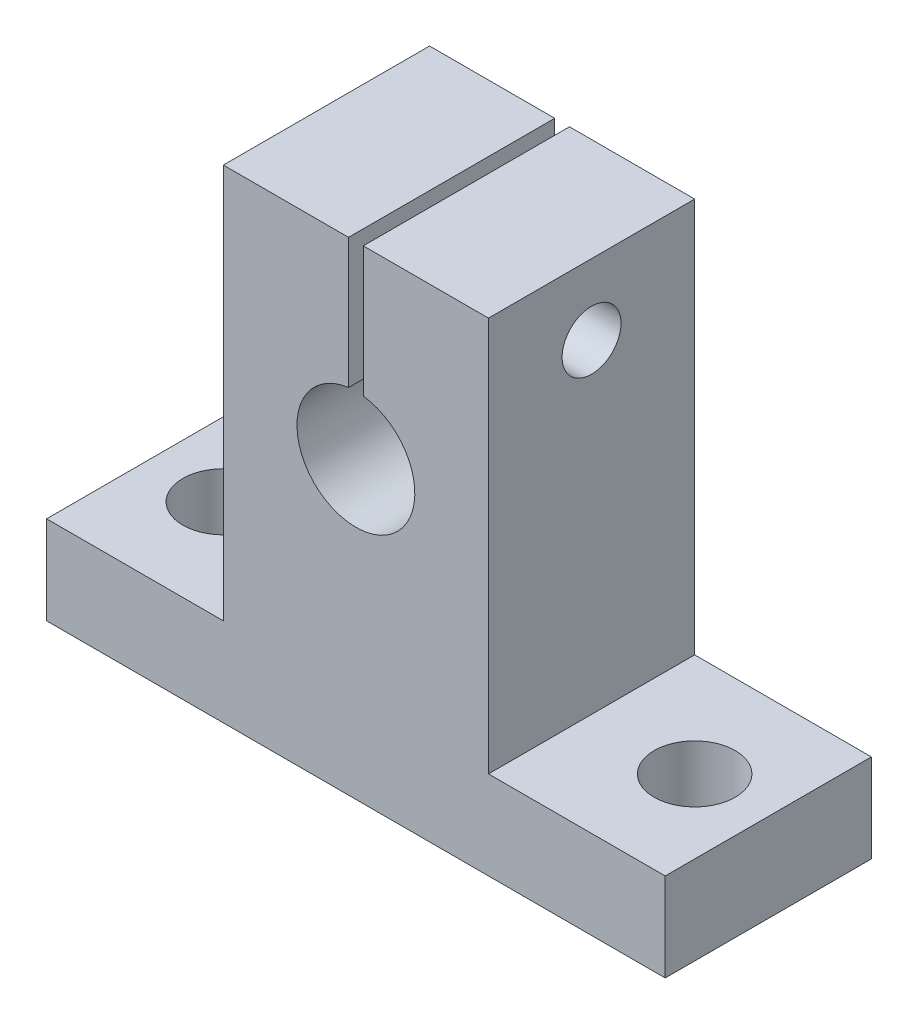
ISO-10303-21;
HEADER;
FILE_DESCRIPTION(('STEP AP214'),'2;1');
FILE_NAME('part.step','',(''),(''),'','','');
FILE_SCHEMA(('AUTOMOTIVE_DESIGN { 1 0 10303 214 1 1 1 1 }'));
ENDSEC;
DATA;
#1=APPLICATION_CONTEXT('core data for automotive mechanical design processes');
#2=APPLICATION_PROTOCOL_DEFINITION('international standard','automotive_design',2000,#1);
#3=PRODUCT_CONTEXT('',#1,'mechanical');
#4=PRODUCT('Part','Part','',(#3));
#5=PRODUCT_RELATED_PRODUCT_CATEGORY('part','',(#4));
#6=PRODUCT_DEFINITION_FORMATION('','',#4);
#7=PRODUCT_DEFINITION_CONTEXT('part definition',#1,'design');
#8=PRODUCT_DEFINITION('design','',#6,#7);
#9=PRODUCT_DEFINITION_SHAPE('','',#8);
#10=(LENGTH_UNIT() NAMED_UNIT(*) SI_UNIT(.MILLI.,.METRE.));
#11=(NAMED_UNIT(*) PLANE_ANGLE_UNIT() SI_UNIT($,.RADIAN.));
#12=(NAMED_UNIT(*) SI_UNIT($,.STERADIAN.) SOLID_ANGLE_UNIT());
#13=UNCERTAINTY_MEASURE_WITH_UNIT(LENGTH_MEASURE(1.E-05),#10,'distance_accuracy_value','');
#14=(GEOMETRIC_REPRESENTATION_CONTEXT(3) GLOBAL_UNCERTAINTY_ASSIGNED_CONTEXT((#13)) GLOBAL_UNIT_ASSIGNED_CONTEXT((#10,
#11,#12)) REPRESENTATION_CONTEXT('',''));
#15=CARTESIAN_POINT('',(0.,0.,0.));
#16=DIRECTION('',(0.,0.,1.));
#17=DIRECTION('',(1.,0.,0.));
#18=AXIS2_PLACEMENT_3D('',#15,#16,#17);
#19=CARTESIAN_POINT('',(9.,6.,7.));
#20=DIRECTION('',(-1.,0.,0.));
#21=DIRECTION('',(0.,0.,1.));
#22=AXIS2_PLACEMENT_3D('',#19,#20,#21);
#23=PLANE('',#22);
#24=CARTESIAN_POINT('',(9.,28.,0.));
#25=DIRECTION('',(1.,0.,0.));
#26=DIRECTION('',(0.,0.,-1.));
#27=AXIS2_PLACEMENT_3D('',#24,#25,#26);
#28=CIRCLE('',#27,2.);
#29=CARTESIAN_POINT('',(9.,28.,-2.));
#30=VERTEX_POINT('',#29);
#31=EDGE_CURVE('E268',#30,#30,#28,.T.);
#32=ORIENTED_EDGE('',*,*,#31,.F.);
#33=EDGE_LOOP('',(#32));
#34=FACE_BOUND('',#33,.T.);
#35=DIRECTION('',(0.,1.,0.));
#36=VECTOR('',#35,1.);
#37=CARTESIAN_POINT('',(9.,6.,-7.));
#38=LINE('',#37,#36);
#39=CARTESIAN_POINT('',(9.,6.,-7.));
#40=VERTEX_POINT('',#39);
#41=CARTESIAN_POINT('',(9.,32.8,-7.));
#42=VERTEX_POINT('',#41);
#43=EDGE_CURVE('E157',#40,#42,#38,.T.);
#44=ORIENTED_EDGE('',*,*,#43,.T.);
#45=DIRECTION('',(0.,0.,-1.));
#46=VECTOR('',#45,1.);
#47=CARTESIAN_POINT('',(9.,32.8,7.));
#48=LINE('',#47,#46);
#49=CARTESIAN_POINT('',(9.,32.8,7.));
#50=VERTEX_POINT('',#49);
#51=EDGE_CURVE('E11',#50,#42,#48,.T.);
#52=ORIENTED_EDGE('',*,*,#51,.F.);
#53=DIRECTION('',(0.,1.,0.));
#54=VECTOR('',#53,1.);
#55=CARTESIAN_POINT('',(9.,6.,7.));
#56=LINE('',#55,#54);
#57=CARTESIAN_POINT('',(9.,6.,7.));
#58=VERTEX_POINT('',#57);
#59=EDGE_CURVE('E180',#58,#50,#56,.T.);
#60=ORIENTED_EDGE('',*,*,#59,.F.);
#61=DIRECTION('',(0.,0.,-1.));
#62=VECTOR('',#61,1.);
#63=CARTESIAN_POINT('',(9.,6.,7.));
#64=LINE('',#63,#62);
#65=EDGE_CURVE('E153',#58,#40,#64,.T.);
#66=ORIENTED_EDGE('',*,*,#65,.T.);
#67=EDGE_LOOP('',(#44,#52,#60,#66));
#68=FACE_BOUND('',#67,.T.);
#69=ADVANCED_FACE('F35',(#34,#68),#23,.F.);
#70=CARTESIAN_POINT('',(0.499999999999996,32.8,7.));
#71=DIRECTION('',(0.,-1.,0.));
#72=DIRECTION('',(0.,0.,-1.));
#73=AXIS2_PLACEMENT_3D('',#70,#71,#72);
#74=PLANE('',#73);
#75=DIRECTION('',(-1.,0.,0.));
#76=VECTOR('',#75,1.);
#77=CARTESIAN_POINT('',(0.499999999999996,32.8,-7.));
#78=LINE('',#77,#76);
#79=CARTESIAN_POINT('',(0.499999999999996,32.8,-7.));
#80=VERTEX_POINT('',#79);
#81=EDGE_CURVE('E160',#42,#80,#78,.T.);
#82=ORIENTED_EDGE('',*,*,#81,.T.);
#83=DIRECTION('',(0.,0.,-1.));
#84=VECTOR('',#83,1.);
#85=CARTESIAN_POINT('',(0.499999999999996,32.8,7.));
#86=LINE('',#85,#84);
#87=CARTESIAN_POINT('',(0.499999999999996,32.8,7.));
#88=VERTEX_POINT('',#87);
#89=EDGE_CURVE('E44',#88,#80,#86,.T.);
#90=ORIENTED_EDGE('',*,*,#89,.F.);
#91=DIRECTION('',(-1.,0.,0.));
#92=VECTOR('',#91,1.);
#93=CARTESIAN_POINT('',(0.499999999999996,32.8,7.));
#94=LINE('',#93,#92);
#95=EDGE_CURVE('E108',#50,#88,#94,.T.);
#96=ORIENTED_EDGE('',*,*,#95,.F.);
#97=ORIENTED_EDGE('',*,*,#51,.T.);
#98=EDGE_LOOP('',(#82,#90,#96,#97));
#99=FACE_BOUND('',#98,.T.);
#100=ADVANCED_FACE('F260',(#99),#74,.F.);
#101=CARTESIAN_POINT('',(0.499999999999996,32.8,7.));
#102=DIRECTION('',(1.,0.,0.));
#103=DIRECTION('',(0.,1.,0.));
#104=AXIS2_PLACEMENT_3D('',#101,#102,#103);
#105=PLANE('',#104);
#106=CARTESIAN_POINT('',(0.499999999999997,28.,0.));
#107=DIRECTION('',(1.,0.,0.));
#108=DIRECTION('',(0.,1.,0.));
#109=AXIS2_PLACEMENT_3D('',#106,#107,#108);
#110=CIRCLE('',#109,2.);
#111=CARTESIAN_POINT('',(0.499999999999997,30.,0.));
#112=VERTEX_POINT('',#111);
#113=EDGE_CURVE('E276',#112,#112,#110,.T.);
#114=ORIENTED_EDGE('',*,*,#113,.T.);
#115=EDGE_LOOP('',(#114));
#116=FACE_BOUND('',#115,.T.);
#117=DIRECTION('',(0.,-1.,0.));
#118=VECTOR('',#117,1.);
#119=CARTESIAN_POINT('',(0.499999999999996,32.8,-7.));
#120=LINE('',#119,#118);
#121=CARTESIAN_POINT('',(0.499999999999998,23.9686269665969,-7.));
#122=VERTEX_POINT('',#121);
#123=EDGE_CURVE('E163',#80,#122,#120,.T.);
#124=ORIENTED_EDGE('',*,*,#123,.T.);
#125=DIRECTION('',(0.,0.,-1.));
#126=VECTOR('',#125,1.);
#127=CARTESIAN_POINT('',(0.499999999999998,23.9686269665969,7.));
#128=LINE('',#127,#126);
#129=CARTESIAN_POINT('',(0.499999999999998,23.9686269665969,7.));
#130=VERTEX_POINT('',#129);
#131=EDGE_CURVE('E199',#130,#122,#128,.T.);
#132=ORIENTED_EDGE('',*,*,#131,.F.);
#133=DIRECTION('',(0.,-1.,0.));
#134=VECTOR('',#133,1.);
#135=CARTESIAN_POINT('',(0.499999999999996,32.8,7.));
#136=LINE('',#135,#134);
#137=EDGE_CURVE('E219',#88,#130,#136,.T.);
#138=ORIENTED_EDGE('',*,*,#137,.F.);
#139=ORIENTED_EDGE('',*,*,#89,.T.);
#140=EDGE_LOOP('',(#124,#132,#138,#139));
#141=FACE_BOUND('',#140,.T.);
#142=ADVANCED_FACE('F265',(#116,#141),#105,.F.);
#143=CARTESIAN_POINT('',(0.,20.,7.));
#144=DIRECTION('',(0.,0.,-1.));
#145=DIRECTION('',(-1.,0.,0.));
#146=AXIS2_PLACEMENT_3D('',#143,#144,#145);
#147=CYLINDRICAL_SURFACE('',#146,4.);
#148=CARTESIAN_POINT('',(0.,20.,-7.));
#149=DIRECTION('',(0.,0.,-1.));
#150=DIRECTION('',(1.,0.,0.));
#151=AXIS2_PLACEMENT_3D('',#148,#149,#150);
#152=CIRCLE('',#151,4.);
#153=CARTESIAN_POINT('',(-0.500000000000002,23.9686269665969,-7.));
#154=VERTEX_POINT('',#153);
#155=EDGE_CURVE('E165',#122,#154,#152,.T.);
#156=ORIENTED_EDGE('',*,*,#155,.T.);
#157=DIRECTION('',(0.,0.,-1.));
#158=VECTOR('',#157,1.);
#159=CARTESIAN_POINT('',(-0.500000000000002,23.9686269665969,7.));
#160=LINE('',#159,#158);
#161=CARTESIAN_POINT('',(-0.500000000000002,23.9686269665969,7.));
#162=VERTEX_POINT('',#161);
#163=EDGE_CURVE('E196',#162,#154,#160,.T.);
#164=ORIENTED_EDGE('',*,*,#163,.F.);
#165=CARTESIAN_POINT('',(0.,20.,7.));
#166=DIRECTION('',(0.,0.,-1.));
#167=DIRECTION('',(1.,0.,0.));
#168=AXIS2_PLACEMENT_3D('',#165,#166,#167);
#169=CIRCLE('',#168,4.);
#170=EDGE_CURVE('E221',#130,#162,#169,.T.);
#171=ORIENTED_EDGE('',*,*,#170,.F.);
#172=ORIENTED_EDGE('',*,*,#131,.T.);
#173=EDGE_LOOP('',(#156,#164,#171,#172));
#174=FACE_BOUND('',#173,.T.);
#175=ADVANCED_FACE('F309',(#174),#147,.F.);
#176=CARTESIAN_POINT('',(-0.500000000000004,32.8,7.));
#177=DIRECTION('',(-1.,0.,0.));
#178=DIRECTION('',(0.,-1.,0.));
#179=AXIS2_PLACEMENT_3D('',#176,#177,#178);
#180=PLANE('',#179);
#181=CARTESIAN_POINT('',(-0.500000000000004,28.,0.));
#182=DIRECTION('',(-1.,0.,0.));
#183=DIRECTION('',(0.,-1.,0.));
#184=AXIS2_PLACEMENT_3D('',#181,#182,#183);
#185=CIRCLE('',#184,2.);
#186=CARTESIAN_POINT('',(-0.500000000000004,26.,0.));
#187=VERTEX_POINT('',#186);
#188=EDGE_CURVE('E272',#187,#187,#185,.T.);
#189=ORIENTED_EDGE('',*,*,#188,.T.);
#190=EDGE_LOOP('',(#189));
#191=FACE_BOUND('',#190,.T.);
#192=DIRECTION('',(0.,1.,0.));
#193=VECTOR('',#192,1.);
#194=CARTESIAN_POINT('',(-0.500000000000004,32.8,-7.));
#195=LINE('',#194,#193);
#196=CARTESIAN_POINT('',(-0.500000000000004,32.8,-7.));
#197=VERTEX_POINT('',#196);
#198=EDGE_CURVE('E167',#154,#197,#195,.T.);
#199=ORIENTED_EDGE('',*,*,#198,.T.);
#200=DIRECTION('',(0.,0.,-1.));
#201=VECTOR('',#200,1.);
#202=CARTESIAN_POINT('',(-0.500000000000004,32.8,7.));
#203=LINE('',#202,#201);
#204=CARTESIAN_POINT('',(-0.500000000000004,32.8,7.));
#205=VERTEX_POINT('',#204);
#206=EDGE_CURVE('E193',#205,#197,#203,.T.);
#207=ORIENTED_EDGE('',*,*,#206,.F.);
#208=DIRECTION('',(0.,1.,0.));
#209=VECTOR('',#208,1.);
#210=CARTESIAN_POINT('',(-0.500000000000004,32.8,7.));
#211=LINE('',#210,#209);
#212=EDGE_CURVE('E223',#162,#205,#211,.T.);
#213=ORIENTED_EDGE('',*,*,#212,.F.);
#214=ORIENTED_EDGE('',*,*,#163,.T.);
#215=EDGE_LOOP('',(#199,#207,#213,#214));
#216=FACE_BOUND('',#215,.T.);
#217=ADVANCED_FACE('F305',(#191,#216),#180,.F.);
#218=CARTESIAN_POINT('',(-9.,32.8,7.));
#219=DIRECTION('',(0.,-1.,0.));
#220=DIRECTION('',(0.,0.,-1.));
#221=AXIS2_PLACEMENT_3D('',#218,#219,#220);
#222=PLANE('',#221);
#223=DIRECTION('',(-1.,0.,0.));
#224=VECTOR('',#223,1.);
#225=CARTESIAN_POINT('',(-9.,32.8,-7.));
#226=LINE('',#225,#224);
#227=CARTESIAN_POINT('',(-9.,32.8,-7.));
#228=VERTEX_POINT('',#227);
#229=EDGE_CURVE('E169',#197,#228,#226,.T.);
#230=ORIENTED_EDGE('',*,*,#229,.T.);
#231=DIRECTION('',(0.,0.,-1.));
#232=VECTOR('',#231,1.);
#233=CARTESIAN_POINT('',(-9.,32.8,7.));
#234=LINE('',#233,#232);
#235=CARTESIAN_POINT('',(-9.,32.8,7.));
#236=VERTEX_POINT('',#235);
#237=EDGE_CURVE('E190',#236,#228,#234,.T.);
#238=ORIENTED_EDGE('',*,*,#237,.F.);
#239=DIRECTION('',(-1.,0.,0.));
#240=VECTOR('',#239,1.);
#241=CARTESIAN_POINT('',(-9.,32.8,7.));
#242=LINE('',#241,#240);
#243=EDGE_CURVE('E225',#205,#236,#242,.T.);
#244=ORIENTED_EDGE('',*,*,#243,.F.);
#245=ORIENTED_EDGE('',*,*,#206,.T.);
#246=EDGE_LOOP('',(#230,#238,#244,#245));
#247=FACE_BOUND('',#246,.T.);
#248=ADVANCED_FACE('F301',(#247),#222,.F.);
#249=CARTESIAN_POINT('',(-9.,6.,7.));
#250=DIRECTION('',(1.,0.,0.));
#251=DIRECTION('',(0.,0.,-1.));
#252=AXIS2_PLACEMENT_3D('',#249,#250,#251);
#253=PLANE('',#252);
#254=CARTESIAN_POINT('',(-9.,28.,0.));
#255=DIRECTION('',(1.,0.,0.));
#256=DIRECTION('',(0.,0.,-1.));
#257=AXIS2_PLACEMENT_3D('',#254,#255,#256);
#258=CIRCLE('',#257,2.);
#259=CARTESIAN_POINT('',(-9.,28.,-2.));
#260=VERTEX_POINT('',#259);
#261=EDGE_CURVE('E38',#260,#260,#258,.T.);
#262=ORIENTED_EDGE('',*,*,#261,.T.);
#263=EDGE_LOOP('',(#262));
#264=FACE_BOUND('',#263,.T.);
#265=DIRECTION('',(0.,-1.,0.));
#266=VECTOR('',#265,1.);
#267=CARTESIAN_POINT('',(-9.,6.,-7.));
#268=LINE('',#267,#266);
#269=CARTESIAN_POINT('',(-9.,6.,-7.));
#270=VERTEX_POINT('',#269);
#271=EDGE_CURVE('E171',#228,#270,#268,.T.);
#272=ORIENTED_EDGE('',*,*,#271,.T.);
#273=DIRECTION('',(0.,0.,-1.));
#274=VECTOR('',#273,1.);
#275=CARTESIAN_POINT('',(-9.,6.,7.));
#276=LINE('',#275,#274);
#277=CARTESIAN_POINT('',(-9.,6.,7.));
#278=VERTEX_POINT('',#277);
#279=EDGE_CURVE('E187',#278,#270,#276,.T.);
#280=ORIENTED_EDGE('',*,*,#279,.F.);
#281=DIRECTION('',(0.,-1.,0.));
#282=VECTOR('',#281,1.);
#283=CARTESIAN_POINT('',(-9.,6.,7.));
#284=LINE('',#283,#282);
#285=EDGE_CURVE('E227',#236,#278,#284,.T.);
#286=ORIENTED_EDGE('',*,*,#285,.F.);
#287=ORIENTED_EDGE('',*,*,#237,.T.);
#288=EDGE_LOOP('',(#272,#280,#286,#287));
#289=FACE_BOUND('',#288,.T.);
#290=ADVANCED_FACE('F297',(#264,#289),#253,.F.);
#291=CARTESIAN_POINT('',(-21.,6.,7.));
#292=DIRECTION('',(0.,-1.,0.));
#293=DIRECTION('',(0.,0.,-1.));
#294=AXIS2_PLACEMENT_3D('',#291,#292,#293);
#295=PLANE('',#294);
#296=CARTESIAN_POINT('',(-16.,6.,0.));
#297=DIRECTION('',(0.,1.,0.));
#298=DIRECTION('',(0.,0.,1.));
#299=AXIS2_PLACEMENT_3D('',#296,#297,#298);
#300=CIRCLE('',#299,2.75);
#301=CARTESIAN_POINT('',(-16.,6.,2.75));
#302=VERTEX_POINT('',#301);
#303=EDGE_CURVE('E204',#302,#302,#300,.T.);
#304=ORIENTED_EDGE('',*,*,#303,.F.);
#305=EDGE_LOOP('',(#304));
#306=FACE_BOUND('',#305,.T.);
#307=DIRECTION('',(-1.,0.,0.));
#308=VECTOR('',#307,1.);
#309=CARTESIAN_POINT('',(-21.,6.,-7.));
#310=LINE('',#309,#308);
#311=CARTESIAN_POINT('',(-21.,6.,-7.));
#312=VERTEX_POINT('',#311);
#313=EDGE_CURVE('E173',#270,#312,#310,.T.);
#314=ORIENTED_EDGE('',*,*,#313,.T.);
#315=DIRECTION('',(0.,0.,-1.));
#316=VECTOR('',#315,1.);
#317=CARTESIAN_POINT('',(-21.,6.,7.));
#318=LINE('',#317,#316);
#319=CARTESIAN_POINT('',(-21.,6.,7.));
#320=VERTEX_POINT('',#319);
#321=EDGE_CURVE('E184',#320,#312,#318,.T.);
#322=ORIENTED_EDGE('',*,*,#321,.F.);
#323=DIRECTION('',(-1.,0.,0.));
#324=VECTOR('',#323,1.);
#325=CARTESIAN_POINT('',(-21.,6.,7.));
#326=LINE('',#325,#324);
#327=EDGE_CURVE('E229',#278,#320,#326,.T.);
#328=ORIENTED_EDGE('',*,*,#327,.F.);
#329=ORIENTED_EDGE('',*,*,#279,.T.);
#330=EDGE_LOOP('',(#314,#322,#328,#329));
#331=FACE_BOUND('',#330,.T.);
#332=ADVANCED_FACE('F235',(#306,#331),#295,.F.);
#333=CARTESIAN_POINT('',(-21.,0.,7.));
#334=DIRECTION('',(1.,0.,0.));
#335=DIRECTION('',(0.,1.,0.));
#336=AXIS2_PLACEMENT_3D('',#333,#334,#335);
#337=PLANE('',#336);
#338=DIRECTION('',(0.,-1.,0.));
#339=VECTOR('',#338,1.);
#340=CARTESIAN_POINT('',(-21.,0.,-7.));
#341=LINE('',#340,#339);
#342=CARTESIAN_POINT('',(-21.,0.,-7.));
#343=VERTEX_POINT('',#342);
#344=EDGE_CURVE('E175',#312,#343,#341,.T.);
#345=ORIENTED_EDGE('',*,*,#344,.T.);
#346=DIRECTION('',(0.,0.,-1.));
#347=VECTOR('',#346,1.);
#348=CARTESIAN_POINT('',(-21.,0.,7.));
#349=LINE('',#348,#347);
#350=CARTESIAN_POINT('',(-21.,0.,7.));
#351=VERTEX_POINT('',#350);
#352=EDGE_CURVE('E148',#351,#343,#349,.T.);
#353=ORIENTED_EDGE('',*,*,#352,.F.);
#354=DIRECTION('',(0.,-1.,0.));
#355=VECTOR('',#354,1.);
#356=CARTESIAN_POINT('',(-21.,0.,7.));
#357=LINE('',#356,#355);
#358=EDGE_CURVE('E139',#320,#351,#357,.T.);
#359=ORIENTED_EDGE('',*,*,#358,.F.);
#360=ORIENTED_EDGE('',*,*,#321,.T.);
#361=EDGE_LOOP('',(#345,#353,#359,#360));
#362=FACE_BOUND('',#361,.T.);
#363=ADVANCED_FACE('F239',(#362),#337,.F.);
#364=CARTESIAN_POINT('',(-21.,0.,7.));
#365=DIRECTION('',(0.,1.,0.));
#366=DIRECTION('',(0.,0.,1.));
#367=AXIS2_PLACEMENT_3D('',#364,#365,#366);
#368=PLANE('',#367);
#369=CARTESIAN_POINT('',(16.,0.,0.));
#370=DIRECTION('',(0.,1.,0.));
#371=DIRECTION('',(0.,0.,1.));
#372=AXIS2_PLACEMENT_3D('',#369,#370,#371);
#373=CIRCLE('',#372,2.75);
#374=CARTESIAN_POINT('',(16.,0.,2.75));
#375=VERTEX_POINT('',#374);
#376=EDGE_CURVE('E208',#375,#375,#373,.T.);
#377=ORIENTED_EDGE('',*,*,#376,.T.);
#378=EDGE_LOOP('',(#377));
#379=FACE_BOUND('',#378,.T.);
#380=CARTESIAN_POINT('',(-16.,0.,0.));
#381=DIRECTION('',(0.,1.,0.));
#382=DIRECTION('',(0.,0.,1.));
#383=AXIS2_PLACEMENT_3D('',#380,#381,#382);
#384=CIRCLE('',#383,2.75);
#385=CARTESIAN_POINT('',(-16.,0.,2.75));
#386=VERTEX_POINT('',#385);
#387=EDGE_CURVE('E161',#386,#386,#384,.T.);
#388=ORIENTED_EDGE('',*,*,#387,.T.);
#389=EDGE_LOOP('',(#388));
#390=FACE_BOUND('',#389,.T.);
#391=DIRECTION('',(1.,0.,0.));
#392=VECTOR('',#391,1.);
#393=CARTESIAN_POINT('',(-21.,0.,-7.));
#394=LINE('',#393,#392);
#395=CARTESIAN_POINT('',(21.,0.,-7.));
#396=VERTEX_POINT('',#395);
#397=EDGE_CURVE('E147',#343,#396,#394,.T.);
#398=ORIENTED_EDGE('',*,*,#397,.T.);
#399=DIRECTION('',(0.,0.,-1.));
#400=VECTOR('',#399,1.);
#401=CARTESIAN_POINT('',(21.,0.,7.));
#402=LINE('',#401,#400);
#403=CARTESIAN_POINT('',(21.,0.,7.));
#404=VERTEX_POINT('',#403);
#405=EDGE_CURVE('E144',#404,#396,#402,.T.);
#406=ORIENTED_EDGE('',*,*,#405,.F.);
#407=DIRECTION('',(1.,0.,0.));
#408=VECTOR('',#407,1.);
#409=CARTESIAN_POINT('',(-21.,0.,7.));
#410=LINE('',#409,#408);
#411=EDGE_CURVE('E133',#351,#404,#410,.T.);
#412=ORIENTED_EDGE('',*,*,#411,.F.);
#413=ORIENTED_EDGE('',*,*,#352,.T.);
#414=EDGE_LOOP('',(#398,#406,#412,#413));
#415=FACE_BOUND('',#414,.T.);
#416=ADVANCED_FACE('F145',(#379,#390,#415),#368,.F.);
#417=CARTESIAN_POINT('',(21.,0.,7.));
#418=DIRECTION('',(-1.,0.,0.));
#419=DIRECTION('',(0.,0.,1.));
#420=AXIS2_PLACEMENT_3D('',#417,#418,#419);
#421=PLANE('',#420);
#422=DIRECTION('',(0.,1.,0.));
#423=VECTOR('',#422,1.);
#424=CARTESIAN_POINT('',(21.,0.,-7.));
#425=LINE('',#424,#423);
#426=CARTESIAN_POINT('',(21.,6.,-7.));
#427=VERTEX_POINT('',#426);
#428=EDGE_CURVE('E94',#396,#427,#425,.T.);
#429=ORIENTED_EDGE('',*,*,#428,.T.);
#430=DIRECTION('',(0.,0.,-1.));
#431=VECTOR('',#430,1.);
#432=CARTESIAN_POINT('',(21.,6.,7.));
#433=LINE('',#432,#431);
#434=CARTESIAN_POINT('',(21.,6.,7.));
#435=VERTEX_POINT('',#434);
#436=EDGE_CURVE('E149',#435,#427,#433,.T.);
#437=ORIENTED_EDGE('',*,*,#436,.F.);
#438=DIRECTION('',(0.,1.,0.));
#439=VECTOR('',#438,1.);
#440=CARTESIAN_POINT('',(21.,0.,7.));
#441=LINE('',#440,#439);
#442=EDGE_CURVE('E137',#404,#435,#441,.T.);
#443=ORIENTED_EDGE('',*,*,#442,.F.);
#444=ORIENTED_EDGE('',*,*,#405,.T.);
#445=EDGE_LOOP('',(#429,#437,#443,#444));
#446=FACE_BOUND('',#445,.T.);
#447=ADVANCED_FACE('F151',(#446),#421,.F.);
#448=CARTESIAN_POINT('',(9.,6.,7.));
#449=DIRECTION('',(0.,-1.,0.));
#450=DIRECTION('',(0.,0.,-1.));
#451=AXIS2_PLACEMENT_3D('',#448,#449,#450);
#452=PLANE('',#451);
#453=CARTESIAN_POINT('',(16.,6.,0.));
#454=DIRECTION('',(0.,1.,0.));
#455=DIRECTION('',(0.,0.,1.));
#456=AXIS2_PLACEMENT_3D('',#453,#454,#455);
#457=CIRCLE('',#456,2.75);
#458=CARTESIAN_POINT('',(16.,6.,2.75));
#459=VERTEX_POINT('',#458);
#460=EDGE_CURVE('E213',#459,#459,#457,.T.);
#461=ORIENTED_EDGE('',*,*,#460,.F.);
#462=EDGE_LOOP('',(#461));
#463=FACE_BOUND('',#462,.T.);
#464=DIRECTION('',(-1.,0.,0.));
#465=VECTOR('',#464,1.);
#466=CARTESIAN_POINT('',(9.,6.,-7.));
#467=LINE('',#466,#465);
#468=EDGE_CURVE('E100',#427,#40,#467,.T.);
#469=ORIENTED_EDGE('',*,*,#468,.T.);
#470=ORIENTED_EDGE('',*,*,#65,.F.);
#471=DIRECTION('',(-1.,0.,0.));
#472=VECTOR('',#471,1.);
#473=CARTESIAN_POINT('',(9.,6.,7.));
#474=LINE('',#473,#472);
#475=EDGE_CURVE('E53',#435,#58,#474,.T.);
#476=ORIENTED_EDGE('',*,*,#475,.F.);
#477=ORIENTED_EDGE('',*,*,#436,.T.);
#478=EDGE_LOOP('',(#469,#470,#476,#477));
#479=FACE_BOUND('',#478,.T.);
#480=ADVANCED_FACE('F247',(#463,#479),#452,.F.);
#481=CARTESIAN_POINT('',(0.,20.,7.));
#482=DIRECTION('',(0.,0.,1.));
#483=DIRECTION('',(1.,0.,0.));
#484=AXIS2_PLACEMENT_3D('',#481,#482,#483);
#485=PLANE('',#484);
#486=ORIENTED_EDGE('',*,*,#59,.T.);
#487=ORIENTED_EDGE('',*,*,#95,.T.);
#488=ORIENTED_EDGE('',*,*,#137,.T.);
#489=ORIENTED_EDGE('',*,*,#170,.T.);
#490=ORIENTED_EDGE('',*,*,#212,.T.);
#491=ORIENTED_EDGE('',*,*,#243,.T.);
#492=ORIENTED_EDGE('',*,*,#285,.T.);
#493=ORIENTED_EDGE('',*,*,#327,.T.);
#494=ORIENTED_EDGE('',*,*,#358,.T.);
#495=ORIENTED_EDGE('',*,*,#411,.T.);
#496=ORIENTED_EDGE('',*,*,#442,.T.);
#497=ORIENTED_EDGE('',*,*,#475,.T.);
#498=EDGE_LOOP('',(#486,#487,#488,#489,#490,#491,#492,#493,#494,#495,#496,#497));
#499=FACE_BOUND('',#498,.T.);
#500=ADVANCED_FACE('F135',(#499),#485,.T.);
#501=CARTESIAN_POINT('',(0.,20.,-7.));
#502=DIRECTION('',(0.,0.,1.));
#503=DIRECTION('',(1.,0.,0.));
#504=AXIS2_PLACEMENT_3D('',#501,#502,#503);
#505=PLANE('',#504);
#506=ORIENTED_EDGE('',*,*,#43,.F.);
#507=ORIENTED_EDGE('',*,*,#468,.F.);
#508=ORIENTED_EDGE('',*,*,#428,.F.);
#509=ORIENTED_EDGE('',*,*,#397,.F.);
#510=ORIENTED_EDGE('',*,*,#344,.F.);
#511=ORIENTED_EDGE('',*,*,#313,.F.);
#512=ORIENTED_EDGE('',*,*,#271,.F.);
#513=ORIENTED_EDGE('',*,*,#229,.F.);
#514=ORIENTED_EDGE('',*,*,#198,.F.);
#515=ORIENTED_EDGE('',*,*,#155,.F.);
#516=ORIENTED_EDGE('',*,*,#123,.F.);
#517=ORIENTED_EDGE('',*,*,#81,.F.);
#518=EDGE_LOOP('',(#506,#507,#508,#509,#510,#511,#512,#513,#514,#515,#516,#517));
#519=FACE_BOUND('',#518,.T.);
#520=ADVANCED_FACE('F242',(#519),#505,.F.);
#521=CARTESIAN_POINT('',(-16.,-8.,0.));
#522=DIRECTION('',(0.,1.,0.));
#523=DIRECTION('',(0.,0.,1.));
#524=AXIS2_PLACEMENT_3D('',#521,#522,#523);
#525=CYLINDRICAL_SURFACE('',#524,2.75);
#526=ORIENTED_EDGE('',*,*,#303,.T.);
#527=EDGE_LOOP('',(#526));
#528=FACE_BOUND('',#527,.T.);
#529=ORIENTED_EDGE('',*,*,#387,.F.);
#530=EDGE_LOOP('',(#529));
#531=FACE_BOUND('',#530,.T.);
#532=ADVANCED_FACE('F284',(#528,#531),#525,.F.);
#533=CARTESIAN_POINT('',(16.,-8.,0.));
#534=DIRECTION('',(0.,1.,0.));
#535=DIRECTION('',(0.,0.,1.));
#536=AXIS2_PLACEMENT_3D('',#533,#534,#535);
#537=CYLINDRICAL_SURFACE('',#536,2.75);
#538=ORIENTED_EDGE('',*,*,#460,.T.);
#539=EDGE_LOOP('',(#538));
#540=FACE_BOUND('',#539,.T.);
#541=ORIENTED_EDGE('',*,*,#376,.F.);
#542=EDGE_LOOP('',(#541));
#543=FACE_BOUND('',#542,.T.);
#544=ADVANCED_FACE('F280',(#540,#543),#537,.F.);
#545=CARTESIAN_POINT('',(-10.,28.,0.));
#546=DIRECTION('',(1.,0.,0.));
#547=DIRECTION('',(0.,0.,-1.));
#548=AXIS2_PLACEMENT_3D('',#545,#546,#547);
#549=CYLINDRICAL_SURFACE('',#548,2.);
#550=ORIENTED_EDGE('',*,*,#261,.F.);
#551=EDGE_LOOP('',(#550));
#552=FACE_BOUND('',#551,.T.);
#553=ORIENTED_EDGE('',*,*,#188,.F.);
#554=EDGE_LOOP('',(#553));
#555=FACE_BOUND('',#554,.T.);
#556=ADVANCED_FACE('F283',(#552,#555),#549,.F.);
#557=ORIENTED_EDGE('',*,*,#31,.T.);
#558=EDGE_LOOP('',(#557));
#559=FACE_BOUND('',#558,.T.);
#560=ORIENTED_EDGE('',*,*,#113,.F.);
#561=EDGE_LOOP('',(#560));
#562=FACE_BOUND('',#561,.T.);
#563=ADVANCED_FACE('F335',(#559,#562),#549,.F.);
#564=CLOSED_SHELL('',(#69,#100,#142,#175,#217,#248,#290,#332,#363,#416,#447,#480,#500,#520,#532,
#544,#556,#563));
#565=MANIFOLD_SOLID_BREP('B2',#564);
#566=ADVANCED_BREP_SHAPE_REPRESENTATION('',(#18,#565),#14);
#567=SHAPE_DEFINITION_REPRESENTATION(#9,#566);
ENDSEC;
END-ISO-10303-21;
